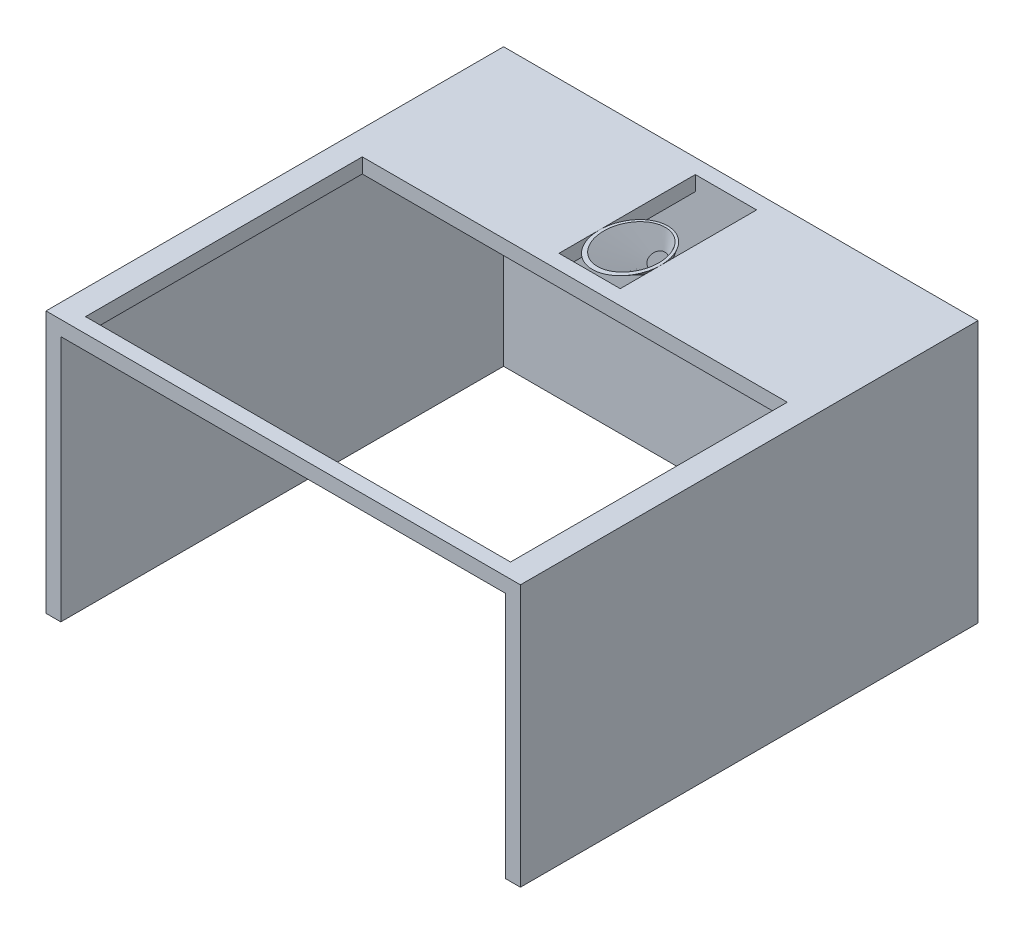
ISO-10303-21;
HEADER;
FILE_DESCRIPTION(('STEP AP214'),'2;1');
FILE_NAME('part.step','',(''),(''),'','','');
FILE_SCHEMA(('AUTOMOTIVE_DESIGN { 1 0 10303 214 1 1 1 1 }'));
ENDSEC;
DATA;
#1=APPLICATION_CONTEXT('core data for automotive mechanical design processes');
#2=APPLICATION_PROTOCOL_DEFINITION('international standard','automotive_design',2000,#1);
#3=PRODUCT_CONTEXT('',#1,'mechanical');
#4=PRODUCT('Part','Part','',(#3));
#5=PRODUCT_RELATED_PRODUCT_CATEGORY('part','',(#4));
#6=PRODUCT_DEFINITION_FORMATION('','',#4);
#7=PRODUCT_DEFINITION_CONTEXT('part definition',#1,'design');
#8=PRODUCT_DEFINITION('design','',#6,#7);
#9=PRODUCT_DEFINITION_SHAPE('','',#8);
#10=(LENGTH_UNIT() NAMED_UNIT(*) SI_UNIT(.MILLI.,.METRE.));
#11=(NAMED_UNIT(*) PLANE_ANGLE_UNIT() SI_UNIT($,.RADIAN.));
#12=(NAMED_UNIT(*) SI_UNIT($,.STERADIAN.) SOLID_ANGLE_UNIT());
#13=UNCERTAINTY_MEASURE_WITH_UNIT(LENGTH_MEASURE(1.E-05),#10,'distance_accuracy_value','');
#14=(GEOMETRIC_REPRESENTATION_CONTEXT(3) GLOBAL_UNCERTAINTY_ASSIGNED_CONTEXT((#13)) GLOBAL_UNIT_ASSIGNED_CONTEXT((#10,
#11,#12)) REPRESENTATION_CONTEXT('',''));
#15=CARTESIAN_POINT('',(0.,0.,0.));
#16=DIRECTION('',(0.,0.,1.));
#17=DIRECTION('',(1.,0.,0.));
#18=AXIS2_PLACEMENT_3D('',#15,#16,#17);
#19=CARTESIAN_POINT('',(0.,-21.0016275925318,-12.1252953439687));
#20=DIRECTION('',(0.,0.866025403784437,0.500000000000003));
#21=DIRECTION('',(0.,-0.500000000000003,0.866025403784437));
#22=AXIS2_PLACEMENT_3D('',#19,#20,#21);
#23=PLANE('',#22);
#24=CARTESIAN_POINT('',(0.,-2.13990956946733,-44.7947492779538));
#25=DIRECTION('',(0.,-0.866025403784437,-0.500000000000003));
#26=DIRECTION('',(0.,0.500000000000003,-0.866025403784437));
#27=AXIS2_PLACEMENT_3D('',#24,#25,#26);
#28=CIRCLE('',#27,1.66486581285724);
#29=CARTESIAN_POINT('',(0.,-1.30747666303871,-46.2365653657804));
#30=VERTEX_POINT('',#29);
#31=EDGE_CURVE('E11',#30,#30,#28,.T.);
#32=ORIENTED_EDGE('',*,*,#31,.F.);
#33=EDGE_LOOP('',(#32));
#34=FACE_BOUND('',#33,.T.);
#35=CARTESIAN_POINT('',(0.,-2.13990956946734,-44.7947492779538));
#36=DIRECTION('',(0.,-0.866025403784437,-0.500000000000003));
#37=DIRECTION('',(0.,0.500000000000003,-0.866025403784437));
#38=AXIS2_PLACEMENT_3D('',#35,#36,#37);
#39=CIRCLE('',#38,2.2481825114649);
#40=CARTESIAN_POINT('',(0.,-1.01581831373488,-46.7417324452263));
#41=VERTEX_POINT('',#40);
#42=EDGE_CURVE('E56',#41,#41,#39,.T.);
#43=ORIENTED_EDGE('',*,*,#42,.T.);
#44=EDGE_LOOP('',(#43));
#45=FACE_BOUND('',#44,.T.);
#46=ADVANCED_FACE('F49',(#34,#45),#23,.F.);
#47=CARTESIAN_POINT('',(0.,-2.13990956946733,-44.7947492779538));
#48=DIRECTION('',(0.,0.866025403784437,0.500000000000003));
#49=DIRECTION('',(0.,-0.500000000000003,0.866025403784437));
#50=AXIS2_PLACEMENT_3D('',#47,#48,#49);
#51=CONICAL_SURFACE('',#50,1.66486581285724,0.541052068118244);
#52=CARTESIAN_POINT('',(0.,3.,-39.4451474016927));
#53=DIRECTION('',(0.,-1.,0.));
#54=DIRECTION('',(0.,0.,1.));
#55=AXIS2_PLACEMENT_3D('',#52,#53,#54);
#56=ELLIPSE('',#55,6.86660524891787,5.57736446625655);
#57=CARTESIAN_POINT('',(0.,3.,-32.5785421527748));
#58=VERTEX_POINT('',#57);
#59=EDGE_CURVE('E60',#58,#58,#56,.F.);
#60=ORIENTED_EDGE('',*,*,#59,.T.);
#61=EDGE_LOOP('',(#60));
#62=FACE_BOUND('',#61,.T.);
#63=ORIENTED_EDGE('',*,*,#31,.T.);
#64=EDGE_LOOP('',(#63));
#65=FACE_BOUND('',#64,.T.);
#66=ADVANCED_FACE('F75',(#62,#65),#51,.F.);
#67=CARTESIAN_POINT('',(0.,-2.13990956946734,-44.7947492779538));
#68=DIRECTION('',(0.,0.866025403784437,0.500000000000003));
#69=DIRECTION('',(0.,-0.500000000000003,0.866025403784437));
#70=AXIS2_PLACEMENT_3D('',#67,#68,#69);
#71=CONICAL_SURFACE('',#70,2.2481825114649,0.541052068118244);
#72=CARTESIAN_POINT('',(0.,3.,-39.1795191487968));
#73=DIRECTION('',(0.,-1.,0.));
#74=DIRECTION('',(0.,0.,1.));
#75=AXIS2_PLACEMENT_3D('',#72,#73,#74);
#76=ELLIPSE('',#75,7.63230966583567,6.19930390383323);
#77=CARTESIAN_POINT('',(0.,3.,-31.5472094829611));
#78=VERTEX_POINT('',#77);
#79=EDGE_CURVE('E52',#78,#78,#76,.F.);
#80=ORIENTED_EDGE('',*,*,#79,.F.);
#81=EDGE_LOOP('',(#80));
#82=FACE_BOUND('',#81,.T.);
#83=ORIENTED_EDGE('',*,*,#42,.F.);
#84=EDGE_LOOP('',(#83));
#85=FACE_BOUND('',#84,.T.);
#86=ADVANCED_FACE('F72',(#82,#85),#71,.T.);
#87=CARTESIAN_POINT('',(0.,3.,-47.0101277137866));
#88=DIRECTION('',(0.,-1.,0.));
#89=DIRECTION('',(0.,0.,-1.));
#90=AXIS2_PLACEMENT_3D('',#87,#88,#89);
#91=PLANE('',#90);
#92=ORIENTED_EDGE('',*,*,#79,.T.);
#93=EDGE_LOOP('',(#92));
#94=FACE_BOUND('',#93,.T.);
#95=ORIENTED_EDGE('',*,*,#59,.F.);
#96=EDGE_LOOP('',(#95));
#97=FACE_BOUND('',#96,.T.);
#98=ADVANCED_FACE('F69',(#94,#97),#91,.F.);
#99=CLOSED_SHELL('',(#46,#66,#86,#98));
#100=MANIFOLD_SOLID_BREP('B2',#99);
#101=CARTESIAN_POINT('',(-48.,3.,-31.));
#102=DIRECTION('',(0.,0.,1.));
#103=DIRECTION('',(1.,0.,0.));
#104=AXIS2_PLACEMENT_3D('',#101,#102,#103);
#105=PLANE('',#104);
#106=DIRECTION('',(0.,-1.,0.));
#107=VECTOR('',#106,1.);
#108=CARTESIAN_POINT('',(-6.19930390383323,0.,-31.));
#109=LINE('',#108,#107);
#110=CARTESIAN_POINT('',(-6.19930390383323,3.,-31.));
#111=VERTEX_POINT('',#110);
#112=CARTESIAN_POINT('',(-6.19930390383323,0.,-31.));
#113=VERTEX_POINT('',#112);
#114=EDGE_CURVE('E283',#111,#113,#109,.T.);
#115=ORIENTED_EDGE('',*,*,#114,.F.);
#116=DIRECTION('',(-1.,0.,0.));
#117=VECTOR('',#116,1.);
#118=CARTESIAN_POINT('',(-48.,3.,-31.));
#119=LINE('',#118,#117);
#120=CARTESIAN_POINT('',(6.19930390383323,3.,-31.));
#121=VERTEX_POINT('',#120);
#122=EDGE_CURVE('E362',#121,#111,#119,.T.);
#123=ORIENTED_EDGE('',*,*,#122,.F.);
#124=DIRECTION('',(0.,-1.,0.));
#125=VECTOR('',#124,1.);
#126=CARTESIAN_POINT('',(6.19930390383323,0.,-31.));
#127=LINE('',#126,#125);
#128=CARTESIAN_POINT('',(6.19930390383323,0.,-31.));
#129=VERTEX_POINT('',#128);
#130=EDGE_CURVE('E299',#121,#129,#127,.T.);
#131=ORIENTED_EDGE('',*,*,#130,.T.);
#132=DIRECTION('',(-1.,0.,0.));
#133=VECTOR('',#132,1.);
#134=CARTESIAN_POINT('',(-48.,0.,-31.));
#135=LINE('',#134,#133);
#136=EDGE_CURVE('E358',#129,#113,#135,.T.);
#137=ORIENTED_EDGE('',*,*,#136,.T.);
#138=EDGE_LOOP('',(#115,#123,#131,#137));
#139=FACE_BOUND('',#138,.T.);
#140=ADVANCED_FACE('F117',(#139),#105,.F.);
#141=CARTESIAN_POINT('',(0.,3.,0.));
#142=DIRECTION('',(0.,-1.,0.));
#143=DIRECTION('',(0.,0.,-1.));
#144=AXIS2_PLACEMENT_3D('',#141,#142,#143);
#145=PLANE('',#144);
#146=DIRECTION('',(0.,0.,-1.));
#147=VECTOR('',#146,1.);
#148=CARTESIAN_POINT('',(48.,3.,31.));
#149=LINE('',#148,#147);
#150=CARTESIAN_POINT('',(48.,3.,31.));
#151=VERTEX_POINT('',#150);
#152=CARTESIAN_POINT('',(48.,3.,-61.5927664702121));
#153=VERTEX_POINT('',#152);
#154=EDGE_CURVE('E359',#151,#153,#149,.T.);
#155=ORIENTED_EDGE('',*,*,#154,.T.);
#156=DIRECTION('',(1.,0.,0.));
#157=VECTOR('',#156,1.);
#158=CARTESIAN_POINT('',(0.,3.,-61.5927664702121));
#159=LINE('',#158,#157);
#160=CARTESIAN_POINT('',(-48.,3.,-61.5927664702121));
#161=VERTEX_POINT('',#160);
#162=EDGE_CURVE('E277',#161,#153,#159,.T.);
#163=ORIENTED_EDGE('',*,*,#162,.F.);
#164=DIRECTION('',(0.,0.,1.));
#165=VECTOR('',#164,1.);
#166=CARTESIAN_POINT('',(-48.,3.,31.));
#167=LINE('',#166,#165);
#168=CARTESIAN_POINT('',(-48.,3.,31.));
#169=VERTEX_POINT('',#168);
#170=EDGE_CURVE('E367',#161,#169,#167,.T.);
#171=ORIENTED_EDGE('',*,*,#170,.T.);
#172=DIRECTION('',(1.,0.,0.));
#173=VECTOR('',#172,1.);
#174=CARTESIAN_POINT('',(-48.,3.,31.));
#175=LINE('',#174,#173);
#176=EDGE_CURVE('E370',#169,#151,#175,.T.);
#177=ORIENTED_EDGE('',*,*,#176,.T.);
#178=EDGE_LOOP('',(#155,#163,#171,#177));
#179=FACE_BOUND('',#178,.T.);
#180=DIRECTION('',(1.,0.,0.));
#181=VECTOR('',#180,1.);
#182=CARTESIAN_POINT('',(0.,3.,-58.5927664702121));
#183=LINE('',#182,#181);
#184=CARTESIAN_POINT('',(-6.19930390383323,3.,-58.5927664702121));
#185=VERTEX_POINT('',#184);
#186=CARTESIAN_POINT('',(6.19930390383323,3.,-58.5927664702121));
#187=VERTEX_POINT('',#186);
#188=EDGE_CURVE('E263',#185,#187,#183,.T.);
#189=ORIENTED_EDGE('',*,*,#188,.T.);
#190=DIRECTION('',(0.,0.,1.));
#191=VECTOR('',#190,1.);
#192=CARTESIAN_POINT('',(6.19930390383323,3.,-58.5927664702121));
#193=LINE('',#192,#191);
#194=CARTESIAN_POINT('',(6.19930390383323,3.,-39.1795191487968));
#195=VERTEX_POINT('',#194);
#196=EDGE_CURVE('E311',#187,#195,#193,.T.);
#197=ORIENTED_EDGE('',*,*,#196,.T.);
#198=EDGE_CURVE('E310',#195,#121,#193,.T.);
#199=ORIENTED_EDGE('',*,*,#198,.T.);
#200=ORIENTED_EDGE('',*,*,#122,.T.);
#201=DIRECTION('',(0.,0.,1.));
#202=VECTOR('',#201,1.);
#203=CARTESIAN_POINT('',(-6.19930390383323,3.,-58.5927664702121));
#204=LINE('',#203,#202);
#205=CARTESIAN_POINT('',(-6.19930390383323,3.,-39.1795191487968));
#206=VERTEX_POINT('',#205);
#207=EDGE_CURVE('E294',#206,#111,#204,.T.);
#208=ORIENTED_EDGE('',*,*,#207,.F.);
#209=EDGE_CURVE('E295',#185,#206,#204,.T.);
#210=ORIENTED_EDGE('',*,*,#209,.F.);
#211=EDGE_LOOP('',(#189,#197,#199,#200,#208,#210));
#212=FACE_BOUND('',#211,.T.);
#213=DIRECTION('',(0.,0.,-1.));
#214=VECTOR('',#213,1.);
#215=CARTESIAN_POINT('',(43.,3.,28.));
#216=LINE('',#215,#214);
#217=CARTESIAN_POINT('',(43.,3.,28.));
#218=VERTEX_POINT('',#217);
#219=CARTESIAN_POINT('',(43.,3.,-28.));
#220=VERTEX_POINT('',#219);
#221=EDGE_CURVE('E316',#218,#220,#216,.T.);
#222=ORIENTED_EDGE('',*,*,#221,.F.);
#223=DIRECTION('',(1.,0.,0.));
#224=VECTOR('',#223,1.);
#225=CARTESIAN_POINT('',(-43.,3.,28.));
#226=LINE('',#225,#224);
#227=CARTESIAN_POINT('',(-43.,3.,28.));
#228=VERTEX_POINT('',#227);
#229=EDGE_CURVE('E327',#228,#218,#226,.T.);
#230=ORIENTED_EDGE('',*,*,#229,.F.);
#231=DIRECTION('',(0.,0.,1.));
#232=VECTOR('',#231,1.);
#233=CARTESIAN_POINT('',(-43.,3.,28.));
#234=LINE('',#233,#232);
#235=CARTESIAN_POINT('',(-43.,3.,-28.));
#236=VERTEX_POINT('',#235);
#237=EDGE_CURVE('E323',#236,#228,#234,.T.);
#238=ORIENTED_EDGE('',*,*,#237,.F.);
#239=DIRECTION('',(-1.,0.,0.));
#240=VECTOR('',#239,1.);
#241=CARTESIAN_POINT('',(-43.,3.,-28.));
#242=LINE('',#241,#240);
#243=EDGE_CURVE('E319',#220,#236,#242,.T.);
#244=ORIENTED_EDGE('',*,*,#243,.F.);
#245=EDGE_LOOP('',(#222,#230,#238,#244));
#246=FACE_BOUND('',#245,.T.);
#247=ADVANCED_FACE('F430',(#179,#212,#246),#145,.F.);
#248=CARTESIAN_POINT('',(0.,0.,0.));
#249=DIRECTION('',(0.,-1.,0.));
#250=DIRECTION('',(0.,0.,-1.));
#251=AXIS2_PLACEMENT_3D('',#248,#249,#250);
#252=PLANE('',#251);
#253=DIRECTION('',(-1.,0.,0.));
#254=VECTOR('',#253,1.);
#255=CARTESIAN_POINT('',(0.,0.,-58.5927664702121));
#256=LINE('',#255,#254);
#257=CARTESIAN_POINT('',(45.,0.,-58.5927664702121));
#258=VERTEX_POINT('',#257);
#259=CARTESIAN_POINT('',(6.19930390383323,0.,-58.5927664702121));
#260=VERTEX_POINT('',#259);
#261=EDGE_CURVE('E128',#258,#260,#256,.T.);
#262=ORIENTED_EDGE('',*,*,#261,.F.);
#263=DIRECTION('',(0.,0.,1.));
#264=VECTOR('',#263,1.);
#265=CARTESIAN_POINT('',(45.,0.,0.));
#266=LINE('',#265,#264);
#267=CARTESIAN_POINT('',(45.,0.,31.));
#268=VERTEX_POINT('',#267);
#269=EDGE_CURVE('E257',#258,#268,#266,.T.);
#270=ORIENTED_EDGE('',*,*,#269,.T.);
#271=DIRECTION('',(1.,0.,0.));
#272=VECTOR('',#271,1.);
#273=CARTESIAN_POINT('',(-48.,0.,31.));
#274=LINE('',#273,#272);
#275=CARTESIAN_POINT('',(-45.,0.,31.));
#276=VERTEX_POINT('',#275);
#277=EDGE_CURVE('E363',#276,#268,#274,.T.);
#278=ORIENTED_EDGE('',*,*,#277,.F.);
#279=DIRECTION('',(0.,0.,1.));
#280=VECTOR('',#279,1.);
#281=CARTESIAN_POINT('',(-45.,0.,0.));
#282=LINE('',#281,#280);
#283=CARTESIAN_POINT('',(-45.,0.,-58.5927664702121));
#284=VERTEX_POINT('',#283);
#285=EDGE_CURVE('E141',#284,#276,#282,.T.);
#286=ORIENTED_EDGE('',*,*,#285,.F.);
#287=CARTESIAN_POINT('',(-6.19930390383323,0.,-58.5927664702121));
#288=VERTEX_POINT('',#287);
#289=EDGE_CURVE('E47',#288,#284,#256,.T.);
#290=ORIENTED_EDGE('',*,*,#289,.F.);
#291=DIRECTION('',(0.,0.,1.));
#292=VECTOR('',#291,1.);
#293=CARTESIAN_POINT('',(-6.19930390383323,0.,-58.5927664702121));
#294=LINE('',#293,#292);
#295=EDGE_CURVE('E288',#288,#113,#294,.T.);
#296=ORIENTED_EDGE('',*,*,#295,.T.);
#297=ORIENTED_EDGE('',*,*,#136,.F.);
#298=DIRECTION('',(0.,0.,1.));
#299=VECTOR('',#298,1.);
#300=CARTESIAN_POINT('',(6.19930390383323,0.,-58.5927664702121));
#301=LINE('',#300,#299);
#302=EDGE_CURVE('E304',#260,#129,#301,.T.);
#303=ORIENTED_EDGE('',*,*,#302,.F.);
#304=EDGE_LOOP('',(#262,#270,#278,#286,#290,#296,#297,#303));
#305=FACE_BOUND('',#304,.T.);
#306=DIRECTION('',(1.,0.,0.));
#307=VECTOR('',#306,1.);
#308=CARTESIAN_POINT('',(-43.,0.,28.));
#309=LINE('',#308,#307);
#310=CARTESIAN_POINT('',(-43.,0.,28.));
#311=VERTEX_POINT('',#310);
#312=CARTESIAN_POINT('',(43.,0.,28.));
#313=VERTEX_POINT('',#312);
#314=EDGE_CURVE('E320',#311,#313,#309,.T.);
#315=ORIENTED_EDGE('',*,*,#314,.T.);
#316=DIRECTION('',(0.,0.,-1.));
#317=VECTOR('',#316,1.);
#318=CARTESIAN_POINT('',(43.,0.,28.));
#319=LINE('',#318,#317);
#320=CARTESIAN_POINT('',(43.,0.,-28.));
#321=VERTEX_POINT('',#320);
#322=EDGE_CURVE('E315',#313,#321,#319,.T.);
#323=ORIENTED_EDGE('',*,*,#322,.T.);
#324=DIRECTION('',(-1.,0.,0.));
#325=VECTOR('',#324,1.);
#326=CARTESIAN_POINT('',(-43.,0.,-28.));
#327=LINE('',#326,#325);
#328=CARTESIAN_POINT('',(-43.,0.,-28.));
#329=VERTEX_POINT('',#328);
#330=EDGE_CURVE('E334',#321,#329,#327,.T.);
#331=ORIENTED_EDGE('',*,*,#330,.T.);
#332=DIRECTION('',(0.,0.,1.));
#333=VECTOR('',#332,1.);
#334=CARTESIAN_POINT('',(-43.,0.,28.));
#335=LINE('',#334,#333);
#336=EDGE_CURVE('E338',#329,#311,#335,.T.);
#337=ORIENTED_EDGE('',*,*,#336,.T.);
#338=EDGE_LOOP('',(#315,#323,#331,#337));
#339=FACE_BOUND('',#338,.T.);
#340=ADVANCED_FACE('F427',(#305,#339),#252,.T.);
#341=CARTESIAN_POINT('',(48.,3.,31.));
#342=DIRECTION('',(-1.,0.,0.));
#343=DIRECTION('',(0.,0.,1.));
#344=AXIS2_PLACEMENT_3D('',#341,#342,#343);
#345=PLANE('',#344);
#346=DIRECTION('',(0.,-1.,0.));
#347=VECTOR('',#346,1.);
#348=CARTESIAN_POINT('',(48.,3.,31.));
#349=LINE('',#348,#347);
#350=CARTESIAN_POINT('',(48.,-50.,31.));
#351=VERTEX_POINT('',#350);
#352=EDGE_CURVE('E373',#151,#351,#349,.T.);
#353=ORIENTED_EDGE('',*,*,#352,.T.);
#354=DIRECTION('',(0.,0.,1.));
#355=VECTOR('',#354,1.);
#356=CARTESIAN_POINT('',(48.,-50.,0.));
#357=LINE('',#356,#355);
#358=CARTESIAN_POINT('',(48.,-50.,-61.5927664702121));
#359=VERTEX_POINT('',#358);
#360=EDGE_CURVE('E403',#359,#351,#357,.T.);
#361=ORIENTED_EDGE('',*,*,#360,.F.);
#362=DIRECTION('',(0.,-1.,0.));
#363=VECTOR('',#362,1.);
#364=CARTESIAN_POINT('',(48.,0.,-61.5927664702121));
#365=LINE('',#364,#363);
#366=EDGE_CURVE('E281',#153,#359,#365,.T.);
#367=ORIENTED_EDGE('',*,*,#366,.F.);
#368=ORIENTED_EDGE('',*,*,#154,.F.);
#369=EDGE_LOOP('',(#353,#361,#367,#368));
#370=FACE_BOUND('',#369,.T.);
#371=ADVANCED_FACE('F119',(#370),#345,.F.);
#372=CARTESIAN_POINT('',(-48.,3.,31.));
#373=DIRECTION('',(1.,0.,0.));
#374=DIRECTION('',(0.,0.,-1.));
#375=AXIS2_PLACEMENT_3D('',#372,#373,#374);
#376=PLANE('',#375);
#377=DIRECTION('',(0.,1.,0.));
#378=VECTOR('',#377,1.);
#379=CARTESIAN_POINT('',(-48.,0.,-61.5927664702121));
#380=LINE('',#379,#378);
#381=CARTESIAN_POINT('',(-48.,-50.,-61.5927664702121));
#382=VERTEX_POINT('',#381);
#383=EDGE_CURVE('E268',#382,#161,#380,.T.);
#384=ORIENTED_EDGE('',*,*,#383,.F.);
#385=DIRECTION('',(0.,0.,-1.));
#386=VECTOR('',#385,1.);
#387=CARTESIAN_POINT('',(-48.,-50.,0.));
#388=LINE('',#387,#386);
#389=CARTESIAN_POINT('',(-48.,-50.,31.));
#390=VERTEX_POINT('',#389);
#391=EDGE_CURVE('E394',#390,#382,#388,.T.);
#392=ORIENTED_EDGE('',*,*,#391,.F.);
#393=DIRECTION('',(0.,-1.,0.));
#394=VECTOR('',#393,1.);
#395=CARTESIAN_POINT('',(-48.,3.,31.));
#396=LINE('',#395,#394);
#397=EDGE_CURVE('E121',#169,#390,#396,.T.);
#398=ORIENTED_EDGE('',*,*,#397,.F.);
#399=ORIENTED_EDGE('',*,*,#170,.F.);
#400=EDGE_LOOP('',(#384,#392,#398,#399));
#401=FACE_BOUND('',#400,.T.);
#402=ADVANCED_FACE('F398',(#401),#376,.F.);
#403=CARTESIAN_POINT('',(-48.,3.,31.));
#404=DIRECTION('',(0.,0.,-1.));
#405=DIRECTION('',(-1.,0.,0.));
#406=AXIS2_PLACEMENT_3D('',#403,#404,#405);
#407=PLANE('',#406);
#408=ORIENTED_EDGE('',*,*,#397,.T.);
#409=DIRECTION('',(-1.,0.,0.));
#410=VECTOR('',#409,1.);
#411=CARTESIAN_POINT('',(0.,-50.,31.));
#412=LINE('',#411,#410);
#413=CARTESIAN_POINT('',(-45.,-50.,31.));
#414=VERTEX_POINT('',#413);
#415=EDGE_CURVE('E247',#414,#390,#412,.T.);
#416=ORIENTED_EDGE('',*,*,#415,.F.);
#417=DIRECTION('',(0.,1.,0.));
#418=VECTOR('',#417,1.);
#419=CARTESIAN_POINT('',(-45.,-50.,31.));
#420=LINE('',#419,#418);
#421=EDGE_CURVE('E242',#414,#276,#420,.T.);
#422=ORIENTED_EDGE('',*,*,#421,.T.);
#423=ORIENTED_EDGE('',*,*,#277,.T.);
#424=DIRECTION('',(0.,1.,0.));
#425=VECTOR('',#424,1.);
#426=CARTESIAN_POINT('',(45.,-50.,31.));
#427=LINE('',#426,#425);
#428=CARTESIAN_POINT('',(45.,-50.,31.));
#429=VERTEX_POINT('',#428);
#430=EDGE_CURVE('E270',#429,#268,#427,.T.);
#431=ORIENTED_EDGE('',*,*,#430,.F.);
#432=DIRECTION('',(-1.,0.,0.));
#433=VECTOR('',#432,1.);
#434=CARTESIAN_POINT('',(0.,-50.,31.));
#435=LINE('',#434,#433);
#436=EDGE_CURVE('E408',#351,#429,#435,.T.);
#437=ORIENTED_EDGE('',*,*,#436,.F.);
#438=ORIENTED_EDGE('',*,*,#352,.F.);
#439=ORIENTED_EDGE('',*,*,#176,.F.);
#440=EDGE_LOOP('',(#408,#416,#422,#423,#431,#437,#438,#439));
#441=FACE_BOUND('',#440,.T.);
#442=ADVANCED_FACE('F389',(#441),#407,.F.);
#443=CARTESIAN_POINT('',(43.,3.,28.));
#444=DIRECTION('',(-1.,0.,0.));
#445=DIRECTION('',(0.,0.,1.));
#446=AXIS2_PLACEMENT_3D('',#443,#444,#445);
#447=PLANE('',#446);
#448=ORIENTED_EDGE('',*,*,#322,.F.);
#449=DIRECTION('',(0.,-1.,0.));
#450=VECTOR('',#449,1.);
#451=CARTESIAN_POINT('',(43.,3.,28.));
#452=LINE('',#451,#450);
#453=EDGE_CURVE('E330',#218,#313,#452,.T.);
#454=ORIENTED_EDGE('',*,*,#453,.F.);
#455=ORIENTED_EDGE('',*,*,#221,.T.);
#456=DIRECTION('',(0.,-1.,0.));
#457=VECTOR('',#456,1.);
#458=CARTESIAN_POINT('',(43.,3.,-28.));
#459=LINE('',#458,#457);
#460=EDGE_CURVE('E354',#220,#321,#459,.T.);
#461=ORIENTED_EDGE('',*,*,#460,.T.);
#462=EDGE_LOOP('',(#448,#454,#455,#461));
#463=FACE_BOUND('',#462,.T.);
#464=ADVANCED_FACE('F440',(#463),#447,.T.);
#465=CARTESIAN_POINT('',(-43.,3.,-28.));
#466=DIRECTION('',(0.,0.,1.));
#467=DIRECTION('',(1.,0.,0.));
#468=AXIS2_PLACEMENT_3D('',#465,#466,#467);
#469=PLANE('',#468);
#470=ORIENTED_EDGE('',*,*,#330,.F.);
#471=ORIENTED_EDGE('',*,*,#460,.F.);
#472=ORIENTED_EDGE('',*,*,#243,.T.);
#473=DIRECTION('',(0.,-1.,0.));
#474=VECTOR('',#473,1.);
#475=CARTESIAN_POINT('',(-43.,3.,-28.));
#476=LINE('',#475,#474);
#477=EDGE_CURVE('E351',#236,#329,#476,.T.);
#478=ORIENTED_EDGE('',*,*,#477,.T.);
#479=EDGE_LOOP('',(#470,#471,#472,#478));
#480=FACE_BOUND('',#479,.T.);
#481=ADVANCED_FACE('F447',(#480),#469,.T.);
#482=CARTESIAN_POINT('',(-43.,3.,28.));
#483=DIRECTION('',(1.,0.,0.));
#484=DIRECTION('',(0.,0.,-1.));
#485=AXIS2_PLACEMENT_3D('',#482,#483,#484);
#486=PLANE('',#485);
#487=ORIENTED_EDGE('',*,*,#336,.F.);
#488=ORIENTED_EDGE('',*,*,#477,.F.);
#489=ORIENTED_EDGE('',*,*,#237,.T.);
#490=DIRECTION('',(0.,-1.,0.));
#491=VECTOR('',#490,1.);
#492=CARTESIAN_POINT('',(-43.,3.,28.));
#493=LINE('',#492,#491);
#494=EDGE_CURVE('E348',#228,#311,#493,.T.);
#495=ORIENTED_EDGE('',*,*,#494,.T.);
#496=EDGE_LOOP('',(#487,#488,#489,#495));
#497=FACE_BOUND('',#496,.T.);
#498=ADVANCED_FACE('F449',(#497),#486,.T.);
#499=CARTESIAN_POINT('',(-43.,3.,28.));
#500=DIRECTION('',(0.,0.,-1.));
#501=DIRECTION('',(-1.,0.,0.));
#502=AXIS2_PLACEMENT_3D('',#499,#500,#501);
#503=PLANE('',#502);
#504=ORIENTED_EDGE('',*,*,#314,.F.);
#505=ORIENTED_EDGE('',*,*,#494,.F.);
#506=ORIENTED_EDGE('',*,*,#229,.T.);
#507=ORIENTED_EDGE('',*,*,#453,.T.);
#508=EDGE_LOOP('',(#504,#505,#506,#507));
#509=FACE_BOUND('',#508,.T.);
#510=ADVANCED_FACE('F435',(#509),#503,.T.);
#511=CARTESIAN_POINT('',(6.19930390383323,0.,-58.5927664702121));
#512=DIRECTION('',(-1.,0.,0.));
#513=DIRECTION('',(0.,-1.,0.));
#514=AXIS2_PLACEMENT_3D('',#511,#512,#513);
#515=PLANE('',#514);
#516=ORIENTED_EDGE('',*,*,#130,.F.);
#517=ORIENTED_EDGE('',*,*,#198,.F.);
#518=ORIENTED_EDGE('',*,*,#196,.F.);
#519=DIRECTION('',(0.,-1.,0.));
#520=VECTOR('',#519,1.);
#521=CARTESIAN_POINT('',(6.19930390383323,0.,-58.5927664702121));
#522=LINE('',#521,#520);
#523=EDGE_CURVE('E300',#187,#260,#522,.T.);
#524=ORIENTED_EDGE('',*,*,#523,.T.);
#525=ORIENTED_EDGE('',*,*,#302,.T.);
#526=EDGE_LOOP('',(#516,#517,#518,#524,#525));
#527=FACE_BOUND('',#526,.T.);
#528=ADVANCED_FACE('F456',(#527),#515,.T.);
#529=CARTESIAN_POINT('',(-6.19930390383323,0.,-58.5927664702121));
#530=DIRECTION('',(-1.,0.,0.));
#531=DIRECTION('',(0.,0.,1.));
#532=AXIS2_PLACEMENT_3D('',#529,#530,#531);
#533=PLANE('',#532);
#534=ORIENTED_EDGE('',*,*,#114,.T.);
#535=ORIENTED_EDGE('',*,*,#295,.F.);
#536=DIRECTION('',(0.,-1.,0.));
#537=VECTOR('',#536,1.);
#538=CARTESIAN_POINT('',(-6.19930390383323,0.,-58.5927664702121));
#539=LINE('',#538,#537);
#540=EDGE_CURVE('E285',#185,#288,#539,.T.);
#541=ORIENTED_EDGE('',*,*,#540,.F.);
#542=ORIENTED_EDGE('',*,*,#209,.T.);
#543=ORIENTED_EDGE('',*,*,#207,.T.);
#544=EDGE_LOOP('',(#534,#535,#541,#542,#543));
#545=FACE_BOUND('',#544,.T.);
#546=ADVANCED_FACE('F544',(#545),#533,.F.);
#547=CARTESIAN_POINT('',(0.,0.,-58.5927664702121));
#548=DIRECTION('',(0.,0.,-1.));
#549=DIRECTION('',(-1.,0.,0.));
#550=AXIS2_PLACEMENT_3D('',#547,#548,#549);
#551=PLANE('',#550);
#552=ORIENTED_EDGE('',*,*,#523,.F.);
#553=ORIENTED_EDGE('',*,*,#188,.F.);
#554=ORIENTED_EDGE('',*,*,#540,.T.);
#555=ORIENTED_EDGE('',*,*,#289,.T.);
#556=DIRECTION('',(0.,1.,0.));
#557=VECTOR('',#556,1.);
#558=CARTESIAN_POINT('',(-45.,-50.,-58.5927664702121));
#559=LINE('',#558,#557);
#560=CARTESIAN_POINT('',(-45.,-50.,-58.5927664702121));
#561=VERTEX_POINT('',#560);
#562=EDGE_CURVE('E240',#561,#284,#559,.T.);
#563=ORIENTED_EDGE('',*,*,#562,.F.);
#564=DIRECTION('',(-1.,0.,0.));
#565=VECTOR('',#564,1.);
#566=CARTESIAN_POINT('',(0.,-50.,-58.5927664702121));
#567=LINE('',#566,#565);
#568=CARTESIAN_POINT('',(45.,-50.,-58.5927664702121));
#569=VERTEX_POINT('',#568);
#570=EDGE_CURVE('E248',#569,#561,#567,.T.);
#571=ORIENTED_EDGE('',*,*,#570,.F.);
#572=DIRECTION('',(0.,1.,0.));
#573=VECTOR('',#572,1.);
#574=CARTESIAN_POINT('',(45.,-50.,-58.5927664702121));
#575=LINE('',#574,#573);
#576=EDGE_CURVE('E412',#569,#258,#575,.T.);
#577=ORIENTED_EDGE('',*,*,#576,.T.);
#578=ORIENTED_EDGE('',*,*,#261,.T.);
#579=EDGE_LOOP('',(#552,#553,#554,#555,#563,#571,#577,#578));
#580=FACE_BOUND('',#579,.T.);
#581=ADVANCED_FACE('F260',(#580),#551,.F.);
#582=CARTESIAN_POINT('',(0.,0.,-61.5927664702121));
#583=DIRECTION('',(0.,0.,-1.));
#584=DIRECTION('',(-1.,0.,0.));
#585=AXIS2_PLACEMENT_3D('',#582,#583,#584);
#586=PLANE('',#585);
#587=ORIENTED_EDGE('',*,*,#366,.T.);
#588=DIRECTION('',(1.,0.,0.));
#589=VECTOR('',#588,1.);
#590=CARTESIAN_POINT('',(0.,-50.,-61.5927664702121));
#591=LINE('',#590,#589);
#592=EDGE_CURVE('E400',#382,#359,#591,.T.);
#593=ORIENTED_EDGE('',*,*,#592,.F.);
#594=ORIENTED_EDGE('',*,*,#383,.T.);
#595=ORIENTED_EDGE('',*,*,#162,.T.);
#596=EDGE_LOOP('',(#587,#593,#594,#595));
#597=FACE_BOUND('',#596,.T.);
#598=ADVANCED_FACE('F565',(#597),#586,.T.);
#599=CARTESIAN_POINT('',(-45.,-50.,0.));
#600=DIRECTION('',(-1.,0.,0.));
#601=DIRECTION('',(0.,0.,1.));
#602=AXIS2_PLACEMENT_3D('',#599,#600,#601);
#603=PLANE('',#602);
#604=ORIENTED_EDGE('',*,*,#285,.T.);
#605=ORIENTED_EDGE('',*,*,#421,.F.);
#606=DIRECTION('',(0.,0.,1.));
#607=VECTOR('',#606,1.);
#608=CARTESIAN_POINT('',(-45.,-50.,0.));
#609=LINE('',#608,#607);
#610=EDGE_CURVE('E236',#561,#414,#609,.T.);
#611=ORIENTED_EDGE('',*,*,#610,.F.);
#612=ORIENTED_EDGE('',*,*,#562,.T.);
#613=EDGE_LOOP('',(#604,#605,#611,#612));
#614=FACE_BOUND('',#613,.T.);
#615=ADVANCED_FACE('F238',(#614),#603,.F.);
#616=CARTESIAN_POINT('',(45.,-50.,0.));
#617=DIRECTION('',(-1.,0.,0.));
#618=DIRECTION('',(0.,0.,1.));
#619=AXIS2_PLACEMENT_3D('',#616,#617,#618);
#620=PLANE('',#619);
#621=ORIENTED_EDGE('',*,*,#269,.F.);
#622=ORIENTED_EDGE('',*,*,#576,.F.);
#623=DIRECTION('',(0.,0.,1.));
#624=VECTOR('',#623,1.);
#625=CARTESIAN_POINT('',(45.,-50.,0.));
#626=LINE('',#625,#624);
#627=EDGE_CURVE('E254',#569,#429,#626,.T.);
#628=ORIENTED_EDGE('',*,*,#627,.T.);
#629=ORIENTED_EDGE('',*,*,#430,.T.);
#630=EDGE_LOOP('',(#621,#622,#628,#629));
#631=FACE_BOUND('',#630,.T.);
#632=ADVANCED_FACE('F425',(#631),#620,.T.);
#633=CARTESIAN_POINT('',(0.,-50.,0.));
#634=DIRECTION('',(0.,-1.,0.));
#635=DIRECTION('',(0.,0.,-1.));
#636=AXIS2_PLACEMENT_3D('',#633,#634,#635);
#637=PLANE('',#636);
#638=ORIENTED_EDGE('',*,*,#570,.T.);
#639=ORIENTED_EDGE('',*,*,#610,.T.);
#640=ORIENTED_EDGE('',*,*,#415,.T.);
#641=ORIENTED_EDGE('',*,*,#391,.T.);
#642=ORIENTED_EDGE('',*,*,#592,.T.);
#643=ORIENTED_EDGE('',*,*,#360,.T.);
#644=ORIENTED_EDGE('',*,*,#436,.T.);
#645=ORIENTED_EDGE('',*,*,#627,.F.);
#646=EDGE_LOOP('',(#638,#639,#640,#641,#642,#643,#644,#645));
#647=FACE_BOUND('',#646,.T.);
#648=ADVANCED_FACE('F252',(#647),#637,.T.);
#649=CLOSED_SHELL('',(#140,#247,#340,#371,#402,#442,#464,#481,#498,#510,#528,#546,#581,#598,
#615,#632,#648));
#650=MANIFOLD_SOLID_BREP('B6',#649);
#651=ADVANCED_BREP_SHAPE_REPRESENTATION('',(#18,#100,#650),#14);
#652=SHAPE_DEFINITION_REPRESENTATION(#9,#651);
ENDSEC;
END-ISO-10303-21;
